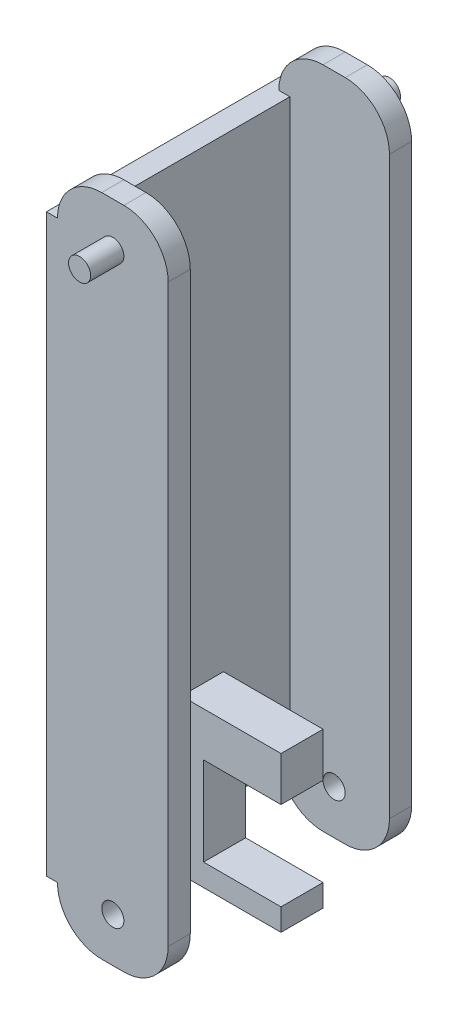
ISO-10303-21;
HEADER;
FILE_DESCRIPTION(('STEP AP214'),'2;1');
FILE_NAME('part.step','',(''),(''),'','','');
FILE_SCHEMA(('AUTOMOTIVE_DESIGN { 1 0 10303 214 1 1 1 1 }'));
ENDSEC;
DATA;
#1=APPLICATION_CONTEXT('core data for automotive mechanical design processes');
#2=APPLICATION_PROTOCOL_DEFINITION('international standard','automotive_design',2000,#1);
#3=PRODUCT_CONTEXT('',#1,'mechanical');
#4=PRODUCT('Part','Part','',(#3));
#5=PRODUCT_RELATED_PRODUCT_CATEGORY('part','',(#4));
#6=PRODUCT_DEFINITION_FORMATION('','',#4);
#7=PRODUCT_DEFINITION_CONTEXT('part definition',#1,'design');
#8=PRODUCT_DEFINITION('design','',#6,#7);
#9=PRODUCT_DEFINITION_SHAPE('','',#8);
#10=(LENGTH_UNIT() NAMED_UNIT(*) SI_UNIT(.MILLI.,.METRE.));
#11=(NAMED_UNIT(*) PLANE_ANGLE_UNIT() SI_UNIT($,.RADIAN.));
#12=(NAMED_UNIT(*) SI_UNIT($,.STERADIAN.) SOLID_ANGLE_UNIT());
#13=UNCERTAINTY_MEASURE_WITH_UNIT(LENGTH_MEASURE(1.E-05),#10,'distance_accuracy_value','');
#14=(GEOMETRIC_REPRESENTATION_CONTEXT(3) GLOBAL_UNCERTAINTY_ASSIGNED_CONTEXT((#13)) GLOBAL_UNIT_ASSIGNED_CONTEXT((#10,
#11,#12)) REPRESENTATION_CONTEXT('',''));
#15=CARTESIAN_POINT('',(0.,0.,0.));
#16=DIRECTION('',(0.,0.,1.));
#17=DIRECTION('',(1.,0.,0.));
#18=AXIS2_PLACEMENT_3D('',#15,#16,#17);
#19=CARTESIAN_POINT('',(-20.,0.,-45.));
#20=DIRECTION('',(-1.,0.,0.));
#21=DIRECTION('',(0.,0.,1.));
#22=AXIS2_PLACEMENT_3D('',#19,#20,#21);
#23=PLANE('',#22);
#24=DIRECTION('',(0.,0.,1.));
#25=VECTOR('',#24,1.);
#26=CARTESIAN_POINT('',(-20.,0.,-45.));
#27=LINE('',#26,#25);
#28=CARTESIAN_POINT('',(-20.,0.,-41.));
#29=VERTEX_POINT('',#28);
#30=CARTESIAN_POINT('',(-20.,0.,0.));
#31=VERTEX_POINT('',#30);
#32=EDGE_CURVE('E408',#29,#31,#27,.T.);
#33=ORIENTED_EDGE('',*,*,#32,.F.);
#34=DIRECTION('',(0.,-1.,0.));
#35=VECTOR('',#34,1.);
#36=CARTESIAN_POINT('',(-20.,30.,-41.));
#37=LINE('',#36,#35);
#38=CARTESIAN_POINT('',(-20.,50.,-41.));
#39=VERTEX_POINT('',#38);
#40=EDGE_CURVE('E275',#39,#29,#37,.T.);
#41=ORIENTED_EDGE('',*,*,#40,.F.);
#42=DIRECTION('',(0.,0.,1.));
#43=VECTOR('',#42,1.);
#44=CARTESIAN_POINT('',(-20.,50.,-41.));
#45=LINE('',#44,#43);
#46=CARTESIAN_POINT('',(-20.,50.,-60.));
#47=VERTEX_POINT('',#46);
#48=EDGE_CURVE('E55',#47,#39,#45,.T.);
#49=ORIENTED_EDGE('',*,*,#48,.F.);
#50=DIRECTION('',(0.,1.,0.));
#51=VECTOR('',#50,1.);
#52=CARTESIAN_POINT('',(-20.,50.,-60.));
#53=LINE('',#52,#51);
#54=CARTESIAN_POINT('',(-20.,0.,-60.));
#55=VERTEX_POINT('',#54);
#56=EDGE_CURVE('E270',#55,#47,#53,.T.);
#57=ORIENTED_EDGE('',*,*,#56,.F.);
#58=CARTESIAN_POINT('',(-20.,0.,-90.));
#59=VERTEX_POINT('',#58);
#60=EDGE_CURVE('E409',#59,#55,#27,.T.);
#61=ORIENTED_EDGE('',*,*,#60,.F.);
#62=DIRECTION('',(0.,-1.,0.));
#63=VECTOR('',#62,1.);
#64=CARTESIAN_POINT('',(-20.,0.,-90.));
#65=LINE('',#64,#63);
#66=CARTESIAN_POINT('',(-20.,260.,-90.));
#67=VERTEX_POINT('',#66);
#68=EDGE_CURVE('E324',#67,#59,#65,.T.);
#69=ORIENTED_EDGE('',*,*,#68,.F.);
#70=DIRECTION('',(0.,0.,1.));
#71=VECTOR('',#70,1.);
#72=CARTESIAN_POINT('',(-20.,260.,-45.));
#73=LINE('',#72,#71);
#74=CARTESIAN_POINT('',(-20.,260.,0.));
#75=VERTEX_POINT('',#74);
#76=EDGE_CURVE('E412',#67,#75,#73,.T.);
#77=ORIENTED_EDGE('',*,*,#76,.T.);
#78=DIRECTION('',(0.,-1.,0.));
#79=VECTOR('',#78,1.);
#80=CARTESIAN_POINT('',(-20.,0.,0.));
#81=LINE('',#80,#79);
#82=EDGE_CURVE('E402',#75,#31,#81,.T.);
#83=ORIENTED_EDGE('',*,*,#82,.T.);
#84=EDGE_LOOP('',(#33,#41,#49,#57,#61,#69,#77,#83));
#85=FACE_BOUND('',#84,.T.);
#86=ADVANCED_FACE('F32',(#85),#23,.F.);
#87=CARTESIAN_POINT('',(-25.,0.,-45.));
#88=DIRECTION('',(0.,1.,0.));
#89=DIRECTION('',(-1.,0.,0.));
#90=AXIS2_PLACEMENT_3D('',#87,#88,#89);
#91=PLANE('',#90);
#92=DIRECTION('',(1.,0.,0.));
#93=VECTOR('',#92,1.);
#94=CARTESIAN_POINT('',(-20.,0.,-60.));
#95=LINE('',#94,#93);
#96=CARTESIAN_POINT('',(-30.,0.,-60.));
#97=VERTEX_POINT('',#96);
#98=EDGE_CURVE('E312',#97,#55,#95,.T.);
#99=ORIENTED_EDGE('',*,*,#98,.F.);
#100=DIRECTION('',(0.,0.,1.));
#101=VECTOR('',#100,1.);
#102=CARTESIAN_POINT('',(-30.,0.,-60.));
#103=LINE('',#102,#101);
#104=CARTESIAN_POINT('',(-30.,0.,-100.));
#105=VERTEX_POINT('',#104);
#106=EDGE_CURVE('E513',#105,#97,#103,.T.);
#107=ORIENTED_EDGE('',*,*,#106,.F.);
#108=DIRECTION('',(1.,0.,0.));
#109=VECTOR('',#108,1.);
#110=CARTESIAN_POINT('',(-30.,0.,-100.));
#111=LINE('',#110,#109);
#112=CARTESIAN_POINT('',(-25.,0.,-100.));
#113=VERTEX_POINT('',#112);
#114=EDGE_CURVE('E262',#105,#113,#111,.T.);
#115=ORIENTED_EDGE('',*,*,#114,.T.);
#116=DIRECTION('',(0.,0.,1.));
#117=VECTOR('',#116,1.);
#118=CARTESIAN_POINT('',(-25.,0.,-100.));
#119=LINE('',#118,#117);
#120=CARTESIAN_POINT('',(-25.,0.,-90.));
#121=VERTEX_POINT('',#120);
#122=EDGE_CURVE('E388',#113,#121,#119,.T.);
#123=ORIENTED_EDGE('',*,*,#122,.T.);
#124=DIRECTION('',(-1.,0.,0.));
#125=VECTOR('',#124,1.);
#126=CARTESIAN_POINT('',(-25.,0.,-90.));
#127=LINE('',#126,#125);
#128=EDGE_CURVE('E327',#59,#121,#127,.T.);
#129=ORIENTED_EDGE('',*,*,#128,.F.);
#130=ORIENTED_EDGE('',*,*,#60,.T.);
#131=EDGE_LOOP('',(#99,#107,#115,#123,#129,#130));
#132=FACE_BOUND('',#131,.T.);
#133=ADVANCED_FACE('F529',(#132),#91,.F.);
#134=DIRECTION('',(-1.,0.,0.));
#135=VECTOR('',#134,1.);
#136=CARTESIAN_POINT('',(-25.,0.,-41.));
#137=LINE('',#136,#135);
#138=CARTESIAN_POINT('',(-30.,0.,-41.));
#139=VERTEX_POINT('',#138);
#140=EDGE_CURVE('E316',#29,#139,#137,.T.);
#141=ORIENTED_EDGE('',*,*,#140,.F.);
#142=ORIENTED_EDGE('',*,*,#32,.T.);
#143=DIRECTION('',(-1.,0.,0.));
#144=VECTOR('',#143,1.);
#145=CARTESIAN_POINT('',(-25.,0.,0.));
#146=LINE('',#145,#144);
#147=CARTESIAN_POINT('',(-25.,0.,0.));
#148=VERTEX_POINT('',#147);
#149=EDGE_CURVE('E405',#31,#148,#146,.T.);
#150=ORIENTED_EDGE('',*,*,#149,.T.);
#151=DIRECTION('',(0.,0.,-1.));
#152=VECTOR('',#151,1.);
#153=CARTESIAN_POINT('',(-25.,0.,10.));
#154=LINE('',#153,#152);
#155=CARTESIAN_POINT('',(-25.,0.,10.));
#156=VERTEX_POINT('',#155);
#157=EDGE_CURVE('E462',#156,#148,#154,.T.);
#158=ORIENTED_EDGE('',*,*,#157,.F.);
#159=DIRECTION('',(1.,0.,0.));
#160=VECTOR('',#159,1.);
#161=CARTESIAN_POINT('',(-30.,0.,10.));
#162=LINE('',#161,#160);
#163=CARTESIAN_POINT('',(-30.,0.,10.));
#164=VERTEX_POINT('',#163);
#165=EDGE_CURVE('E526',#164,#156,#162,.T.);
#166=ORIENTED_EDGE('',*,*,#165,.F.);
#167=DIRECTION('',(0.,0.,1.));
#168=VECTOR('',#167,1.);
#169=CARTESIAN_POINT('',(-30.,0.,10.));
#170=LINE('',#169,#168);
#171=EDGE_CURVE('E247',#139,#164,#170,.T.);
#172=ORIENTED_EDGE('',*,*,#171,.F.);
#173=EDGE_LOOP('',(#141,#142,#150,#158,#166,#172));
#174=FACE_BOUND('',#173,.T.);
#175=ADVANCED_FACE('F588',(#174),#91,.F.);
#176=CARTESIAN_POINT('',(5.,0.,0.));
#177=DIRECTION('',(0.,0.,1.));
#178=DIRECTION('',(1.,0.,0.));
#179=AXIS2_PLACEMENT_3D('',#176,#177,#178);
#180=PLANE('',#179);
#181=CARTESIAN_POINT('',(0.,0.,0.));
#182=DIRECTION('',(0.,0.,1.));
#183=DIRECTION('',(1.,0.,0.));
#184=AXIS2_PLACEMENT_3D('',#181,#182,#183);
#185=CIRCLE('',#184,5.);
#186=CARTESIAN_POINT('',(5.,0.,0.));
#187=VERTEX_POINT('',#186);
#188=EDGE_CURVE('E419',#187,#187,#185,.T.);
#189=ORIENTED_EDGE('',*,*,#188,.T.);
#190=EDGE_LOOP('',(#189));
#191=FACE_BOUND('',#190,.T.);
#192=ORIENTED_EDGE('',*,*,#149,.F.);
#193=ORIENTED_EDGE('',*,*,#82,.F.);
#194=DIRECTION('',(1.,0.,0.));
#195=VECTOR('',#194,1.);
#196=CARTESIAN_POINT('',(-20.,260.,0.));
#197=LINE('',#196,#195);
#198=CARTESIAN_POINT('',(-25.,260.,0.));
#199=VERTEX_POINT('',#198);
#200=EDGE_CURVE('E400',#199,#75,#197,.T.);
#201=ORIENTED_EDGE('',*,*,#200,.F.);
#202=CARTESIAN_POINT('',(-5.,260.,0.));
#203=DIRECTION('',(0.,0.,1.));
#204=DIRECTION('',(-1.,0.,0.));
#205=AXIS2_PLACEMENT_3D('',#202,#203,#204);
#206=CIRCLE('',#205,20.);
#207=CARTESIAN_POINT('',(-5.,280.,0.));
#208=VERTEX_POINT('',#207);
#209=EDGE_CURVE('E451',#208,#199,#206,.T.);
#210=ORIENTED_EDGE('',*,*,#209,.F.);
#211=DIRECTION('',(-1.,0.,0.));
#212=VECTOR('',#211,1.);
#213=CARTESIAN_POINT('',(-5.,280.,0.));
#214=LINE('',#213,#212);
#215=CARTESIAN_POINT('',(4.99999999999996,280.,0.));
#216=VERTEX_POINT('',#215);
#217=EDGE_CURVE('E449',#216,#208,#214,.T.);
#218=ORIENTED_EDGE('',*,*,#217,.F.);
#219=CARTESIAN_POINT('',(4.99999999999996,260.,0.));
#220=DIRECTION('',(0.,0.,1.));
#221=DIRECTION('',(-1.,0.,0.));
#222=AXIS2_PLACEMENT_3D('',#219,#220,#221);
#223=CIRCLE('',#222,20.);
#224=CARTESIAN_POINT('',(25.,260.,0.));
#225=VERTEX_POINT('',#224);
#226=EDGE_CURVE('E447',#225,#216,#223,.T.);
#227=ORIENTED_EDGE('',*,*,#226,.F.);
#228=DIRECTION('',(0.,1.,0.));
#229=VECTOR('',#228,1.);
#230=CARTESIAN_POINT('',(25.,260.,0.));
#231=LINE('',#230,#229);
#232=CARTESIAN_POINT('',(25.,0.,0.));
#233=VERTEX_POINT('',#232);
#234=EDGE_CURVE('E445',#233,#225,#231,.T.);
#235=ORIENTED_EDGE('',*,*,#234,.F.);
#236=CARTESIAN_POINT('',(5.,0.,0.));
#237=DIRECTION('',(0.,0.,1.));
#238=DIRECTION('',(1.,0.,0.));
#239=AXIS2_PLACEMENT_3D('',#236,#237,#238);
#240=CIRCLE('',#239,20.);
#241=CARTESIAN_POINT('',(5.,-20.,0.));
#242=VERTEX_POINT('',#241);
#243=EDGE_CURVE('E425',#242,#233,#240,.T.);
#244=ORIENTED_EDGE('',*,*,#243,.F.);
#245=DIRECTION('',(1.,0.,0.));
#246=VECTOR('',#245,1.);
#247=CARTESIAN_POINT('',(-5.,-20.,0.));
#248=LINE('',#247,#246);
#249=CARTESIAN_POINT('',(-5.,-20.,0.));
#250=VERTEX_POINT('',#249);
#251=EDGE_CURVE('E431',#250,#242,#248,.T.);
#252=ORIENTED_EDGE('',*,*,#251,.F.);
#253=CARTESIAN_POINT('',(-5.,0.,0.));
#254=DIRECTION('',(0.,0.,1.));
#255=DIRECTION('',(-1.,0.,0.));
#256=AXIS2_PLACEMENT_3D('',#253,#254,#255);
#257=CIRCLE('',#256,20.);
#258=EDGE_CURVE('E454',#148,#250,#257,.T.);
#259=ORIENTED_EDGE('',*,*,#258,.F.);
#260=EDGE_LOOP('',(#192,#193,#201,#210,#218,#227,#235,#244,#252,#259));
#261=FACE_BOUND('',#260,.T.);
#262=ADVANCED_FACE('F482',(#191,#261),#180,.F.);
#263=CARTESIAN_POINT('',(5.,0.,10.));
#264=DIRECTION('',(0.,0.,1.));
#265=DIRECTION('',(1.,0.,0.));
#266=AXIS2_PLACEMENT_3D('',#263,#264,#265);
#267=PLANE('',#266);
#268=CARTESIAN_POINT('',(0.,260.,10.));
#269=DIRECTION('',(0.,0.,1.));
#270=DIRECTION('',(1.,0.,0.));
#271=AXIS2_PLACEMENT_3D('',#268,#269,#270);
#272=CIRCLE('',#271,5.);
#273=CARTESIAN_POINT('',(5.00000000000001,260.,10.));
#274=VERTEX_POINT('',#273);
#275=EDGE_CURVE('E415',#274,#274,#272,.T.);
#276=ORIENTED_EDGE('',*,*,#275,.F.);
#277=EDGE_LOOP('',(#276));
#278=FACE_BOUND('',#277,.T.);
#279=CARTESIAN_POINT('',(5.,0.,10.));
#280=DIRECTION('',(0.,0.,1.));
#281=DIRECTION('',(1.,0.,0.));
#282=AXIS2_PLACEMENT_3D('',#279,#280,#281);
#283=CIRCLE('',#282,20.);
#284=CARTESIAN_POINT('',(5.,-20.,10.));
#285=VERTEX_POINT('',#284);
#286=CARTESIAN_POINT('',(25.,0.,10.));
#287=VERTEX_POINT('',#286);
#288=EDGE_CURVE('E428',#285,#287,#283,.T.);
#289=ORIENTED_EDGE('',*,*,#288,.T.);
#290=DIRECTION('',(0.,1.,0.));
#291=VECTOR('',#290,1.);
#292=CARTESIAN_POINT('',(25.,260.,10.));
#293=LINE('',#292,#291);
#294=CARTESIAN_POINT('',(25.,260.,10.));
#295=VERTEX_POINT('',#294);
#296=EDGE_CURVE('E430',#287,#295,#293,.T.);
#297=ORIENTED_EDGE('',*,*,#296,.T.);
#298=CARTESIAN_POINT('',(4.99999999999996,260.,10.));
#299=DIRECTION('',(0.,0.,1.));
#300=DIRECTION('',(-1.,0.,0.));
#301=AXIS2_PLACEMENT_3D('',#298,#299,#300);
#302=CIRCLE('',#301,20.);
#303=CARTESIAN_POINT('',(4.99999999999996,280.,10.));
#304=VERTEX_POINT('',#303);
#305=EDGE_CURVE('E433',#295,#304,#302,.T.);
#306=ORIENTED_EDGE('',*,*,#305,.T.);
#307=DIRECTION('',(-1.,0.,0.));
#308=VECTOR('',#307,1.);
#309=CARTESIAN_POINT('',(-5.,280.,10.));
#310=LINE('',#309,#308);
#311=CARTESIAN_POINT('',(-5.,280.,10.));
#312=VERTEX_POINT('',#311);
#313=EDGE_CURVE('E435',#304,#312,#310,.T.);
#314=ORIENTED_EDGE('',*,*,#313,.T.);
#315=CARTESIAN_POINT('',(-5.,260.,10.));
#316=DIRECTION('',(0.,0.,1.));
#317=DIRECTION('',(-1.,0.,0.));
#318=AXIS2_PLACEMENT_3D('',#315,#316,#317);
#319=CIRCLE('',#318,20.);
#320=CARTESIAN_POINT('',(-25.,260.,10.));
#321=VERTEX_POINT('',#320);
#322=EDGE_CURVE('E256',#312,#321,#319,.T.);
#323=ORIENTED_EDGE('',*,*,#322,.T.);
#324=DIRECTION('',(1.,0.,0.));
#325=VECTOR('',#324,1.);
#326=CARTESIAN_POINT('',(-30.,260.,10.));
#327=LINE('',#326,#325);
#328=CARTESIAN_POINT('',(-30.,260.,10.));
#329=VERTEX_POINT('',#328);
#330=EDGE_CURVE('E234',#329,#321,#327,.T.);
#331=ORIENTED_EDGE('',*,*,#330,.F.);
#332=DIRECTION('',(0.,1.,0.));
#333=VECTOR('',#332,1.);
#334=CARTESIAN_POINT('',(-30.,260.,10.));
#335=LINE('',#334,#333);
#336=EDGE_CURVE('E241',#164,#329,#335,.T.);
#337=ORIENTED_EDGE('',*,*,#336,.F.);
#338=ORIENTED_EDGE('',*,*,#165,.T.);
#339=CARTESIAN_POINT('',(-5.,0.,10.));
#340=DIRECTION('',(0.,0.,1.));
#341=DIRECTION('',(-1.,0.,0.));
#342=AXIS2_PLACEMENT_3D('',#339,#340,#341);
#343=CIRCLE('',#342,20.);
#344=CARTESIAN_POINT('',(-5.,-20.,10.));
#345=VERTEX_POINT('',#344);
#346=EDGE_CURVE('E438',#156,#345,#343,.T.);
#347=ORIENTED_EDGE('',*,*,#346,.T.);
#348=DIRECTION('',(1.,0.,0.));
#349=VECTOR('',#348,1.);
#350=CARTESIAN_POINT('',(-5.,-20.,10.));
#351=LINE('',#350,#349);
#352=EDGE_CURVE('E440',#345,#285,#351,.T.);
#353=ORIENTED_EDGE('',*,*,#352,.T.);
#354=EDGE_LOOP('',(#289,#297,#306,#314,#323,#331,#337,#338,#347,#353));
#355=FACE_BOUND('',#354,.T.);
#356=CARTESIAN_POINT('',(0.,0.,10.));
#357=DIRECTION('',(0.,0.,1.));
#358=DIRECTION('',(1.,0.,0.));
#359=AXIS2_PLACEMENT_3D('',#356,#357,#358);
#360=CIRCLE('',#359,5.);
#361=CARTESIAN_POINT('',(5.,0.,10.));
#362=VERTEX_POINT('',#361);
#363=EDGE_CURVE('E422',#362,#362,#360,.T.);
#364=ORIENTED_EDGE('',*,*,#363,.F.);
#365=EDGE_LOOP('',(#364));
#366=FACE_BOUND('',#365,.T.);
#367=ADVANCED_FACE('F253',(#278,#355,#366),#267,.T.);
#368=CARTESIAN_POINT('',(5.,0.,10.));
#369=DIRECTION('',(0.,0.,-1.));
#370=DIRECTION('',(-1.,0.,0.));
#371=AXIS2_PLACEMENT_3D('',#368,#369,#370);
#372=CYLINDRICAL_SURFACE('',#371,20.);
#373=ORIENTED_EDGE('',*,*,#243,.T.);
#374=DIRECTION('',(0.,0.,-1.));
#375=VECTOR('',#374,1.);
#376=CARTESIAN_POINT('',(25.,0.,10.));
#377=LINE('',#376,#375);
#378=EDGE_CURVE('E11',#287,#233,#377,.T.);
#379=ORIENTED_EDGE('',*,*,#378,.F.);
#380=ORIENTED_EDGE('',*,*,#288,.F.);
#381=DIRECTION('',(0.,0.,-1.));
#382=VECTOR('',#381,1.);
#383=CARTESIAN_POINT('',(5.,-20.,10.));
#384=LINE('',#383,#382);
#385=EDGE_CURVE('E442',#285,#242,#384,.T.);
#386=ORIENTED_EDGE('',*,*,#385,.T.);
#387=EDGE_LOOP('',(#373,#379,#380,#386));
#388=FACE_BOUND('',#387,.T.);
#389=ADVANCED_FACE('F34',(#388),#372,.T.);
#390=CARTESIAN_POINT('',(25.,260.,10.));
#391=DIRECTION('',(-1.,0.,0.));
#392=DIRECTION('',(0.,-1.,0.));
#393=AXIS2_PLACEMENT_3D('',#390,#391,#392);
#394=PLANE('',#393);
#395=ORIENTED_EDGE('',*,*,#234,.T.);
#396=DIRECTION('',(0.,0.,-1.));
#397=VECTOR('',#396,1.);
#398=CARTESIAN_POINT('',(25.,260.,10.));
#399=LINE('',#398,#397);
#400=EDGE_CURVE('E40',#295,#225,#399,.T.);
#401=ORIENTED_EDGE('',*,*,#400,.F.);
#402=ORIENTED_EDGE('',*,*,#296,.F.);
#403=ORIENTED_EDGE('',*,*,#378,.T.);
#404=EDGE_LOOP('',(#395,#401,#402,#403));
#405=FACE_BOUND('',#404,.T.);
#406=ADVANCED_FACE('F625',(#405),#394,.F.);
#407=CARTESIAN_POINT('',(4.99999999999996,260.,10.));
#408=DIRECTION('',(0.,0.,-1.));
#409=DIRECTION('',(-1.,0.,0.));
#410=AXIS2_PLACEMENT_3D('',#407,#408,#409);
#411=CYLINDRICAL_SURFACE('',#410,20.);
#412=ORIENTED_EDGE('',*,*,#226,.T.);
#413=DIRECTION('',(0.,0.,-1.));
#414=VECTOR('',#413,1.);
#415=CARTESIAN_POINT('',(4.99999999999996,280.,10.));
#416=LINE('',#415,#414);
#417=EDGE_CURVE('E469',#304,#216,#416,.T.);
#418=ORIENTED_EDGE('',*,*,#417,.F.);
#419=ORIENTED_EDGE('',*,*,#305,.F.);
#420=ORIENTED_EDGE('',*,*,#400,.T.);
#421=EDGE_LOOP('',(#412,#418,#419,#420));
#422=FACE_BOUND('',#421,.T.);
#423=ADVANCED_FACE('F476',(#422),#411,.T.);
#424=CARTESIAN_POINT('',(-5.,280.,10.));
#425=DIRECTION('',(0.,-1.,0.));
#426=DIRECTION('',(0.,0.,-1.));
#427=AXIS2_PLACEMENT_3D('',#424,#425,#426);
#428=PLANE('',#427);
#429=ORIENTED_EDGE('',*,*,#217,.T.);
#430=DIRECTION('',(0.,0.,-1.));
#431=VECTOR('',#430,1.);
#432=CARTESIAN_POINT('',(-5.,280.,10.));
#433=LINE('',#432,#431);
#434=EDGE_CURVE('E466',#312,#208,#433,.T.);
#435=ORIENTED_EDGE('',*,*,#434,.F.);
#436=ORIENTED_EDGE('',*,*,#313,.F.);
#437=ORIENTED_EDGE('',*,*,#417,.T.);
#438=EDGE_LOOP('',(#429,#435,#436,#437));
#439=FACE_BOUND('',#438,.T.);
#440=ADVANCED_FACE('F488',(#439),#428,.F.);
#441=CARTESIAN_POINT('',(-5.,260.,10.));
#442=DIRECTION('',(0.,0.,-1.));
#443=DIRECTION('',(-1.,0.,0.));
#444=AXIS2_PLACEMENT_3D('',#441,#442,#443);
#445=CYLINDRICAL_SURFACE('',#444,20.);
#446=ORIENTED_EDGE('',*,*,#209,.T.);
#447=DIRECTION('',(0.,0.,-1.));
#448=VECTOR('',#447,1.);
#449=CARTESIAN_POINT('',(-25.,260.,10.));
#450=LINE('',#449,#448);
#451=EDGE_CURVE('E464',#321,#199,#450,.T.);
#452=ORIENTED_EDGE('',*,*,#451,.F.);
#453=ORIENTED_EDGE('',*,*,#322,.F.);
#454=ORIENTED_EDGE('',*,*,#434,.T.);
#455=EDGE_LOOP('',(#446,#452,#453,#454));
#456=FACE_BOUND('',#455,.T.);
#457=ADVANCED_FACE('F491',(#456),#445,.T.);
#458=CARTESIAN_POINT('',(-5.,0.,10.));
#459=DIRECTION('',(0.,0.,-1.));
#460=DIRECTION('',(-1.,0.,0.));
#461=AXIS2_PLACEMENT_3D('',#458,#459,#460);
#462=CYLINDRICAL_SURFACE('',#461,20.);
#463=ORIENTED_EDGE('',*,*,#258,.T.);
#464=DIRECTION('',(0.,0.,-1.));
#465=VECTOR('',#464,1.);
#466=CARTESIAN_POINT('',(-5.,-20.,10.));
#467=LINE('',#466,#465);
#468=EDGE_CURVE('E459',#345,#250,#467,.T.);
#469=ORIENTED_EDGE('',*,*,#468,.F.);
#470=ORIENTED_EDGE('',*,*,#346,.F.);
#471=ORIENTED_EDGE('',*,*,#157,.T.);
#472=EDGE_LOOP('',(#463,#469,#470,#471));
#473=FACE_BOUND('',#472,.T.);
#474=ADVANCED_FACE('F615',(#473),#462,.T.);
#475=CARTESIAN_POINT('',(-5.,-20.,10.));
#476=DIRECTION('',(0.,1.,0.));
#477=DIRECTION('',(-1.,0.,0.));
#478=AXIS2_PLACEMENT_3D('',#475,#476,#477);
#479=PLANE('',#478);
#480=ORIENTED_EDGE('',*,*,#251,.T.);
#481=ORIENTED_EDGE('',*,*,#385,.F.);
#482=ORIENTED_EDGE('',*,*,#352,.F.);
#483=ORIENTED_EDGE('',*,*,#468,.T.);
#484=EDGE_LOOP('',(#480,#481,#482,#483));
#485=FACE_BOUND('',#484,.T.);
#486=ADVANCED_FACE('F605',(#485),#479,.F.);
#487=CARTESIAN_POINT('',(0.,0.,10.));
#488=DIRECTION('',(0.,0.,-1.));
#489=DIRECTION('',(-1.,0.,0.));
#490=AXIS2_PLACEMENT_3D('',#487,#488,#489);
#491=CYLINDRICAL_SURFACE('',#490,5.);
#492=ORIENTED_EDGE('',*,*,#363,.T.);
#493=EDGE_LOOP('',(#492));
#494=FACE_BOUND('',#493,.T.);
#495=ORIENTED_EDGE('',*,*,#188,.F.);
#496=EDGE_LOOP('',(#495));
#497=FACE_BOUND('',#496,.T.);
#498=ADVANCED_FACE('F601',(#494,#497),#491,.F.);
#499=CARTESIAN_POINT('',(0.,260.,25.));
#500=DIRECTION('',(0.,0.,-1.));
#501=DIRECTION('',(-1.,0.,0.));
#502=AXIS2_PLACEMENT_3D('',#499,#500,#501);
#503=CYLINDRICAL_SURFACE('',#502,5.);
#504=CARTESIAN_POINT('',(0.,260.,25.));
#505=DIRECTION('',(0.,0.,1.));
#506=DIRECTION('',(1.,0.,0.));
#507=AXIS2_PLACEMENT_3D('',#504,#505,#506);
#508=CIRCLE('',#507,5.);
#509=CARTESIAN_POINT('',(5.00000000000001,260.,25.));
#510=VERTEX_POINT('',#509);
#511=EDGE_CURVE('E416',#510,#510,#508,.T.);
#512=ORIENTED_EDGE('',*,*,#511,.F.);
#513=EDGE_LOOP('',(#512));
#514=FACE_BOUND('',#513,.T.);
#515=ORIENTED_EDGE('',*,*,#275,.T.);
#516=EDGE_LOOP('',(#515));
#517=FACE_BOUND('',#516,.T.);
#518=ADVANCED_FACE('F597',(#514,#517),#503,.T.);
#519=CARTESIAN_POINT('',(0.,260.,25.));
#520=DIRECTION('',(0.,0.,1.));
#521=DIRECTION('',(1.,0.,0.));
#522=AXIS2_PLACEMENT_3D('',#519,#520,#521);
#523=PLANE('',#522);
#524=ORIENTED_EDGE('',*,*,#511,.T.);
#525=EDGE_LOOP('',(#524));
#526=FACE_BOUND('',#525,.T.);
#527=ADVANCED_FACE('F594',(#526),#523,.T.);
#528=CARTESIAN_POINT('',(-20.,260.,-45.));
#529=DIRECTION('',(0.,-1.,0.));
#530=DIRECTION('',(1.,0.,0.));
#531=AXIS2_PLACEMENT_3D('',#528,#529,#530);
#532=PLANE('',#531);
#533=ORIENTED_EDGE('',*,*,#200,.T.);
#534=ORIENTED_EDGE('',*,*,#76,.F.);
#535=DIRECTION('',(1.,0.,0.));
#536=VECTOR('',#535,1.);
#537=CARTESIAN_POINT('',(-20.,260.,-90.));
#538=LINE('',#537,#536);
#539=CARTESIAN_POINT('',(-25.,260.,-90.));
#540=VERTEX_POINT('',#539);
#541=EDGE_CURVE('E318',#540,#67,#538,.T.);
#542=ORIENTED_EDGE('',*,*,#541,.F.);
#543=DIRECTION('',(0.,0.,1.));
#544=VECTOR('',#543,1.);
#545=CARTESIAN_POINT('',(-25.,260.,-100.));
#546=LINE('',#545,#544);
#547=CARTESIAN_POINT('',(-25.,260.,-100.));
#548=VERTEX_POINT('',#547);
#549=EDGE_CURVE('E390',#548,#540,#546,.T.);
#550=ORIENTED_EDGE('',*,*,#549,.F.);
#551=DIRECTION('',(1.,0.,0.));
#552=VECTOR('',#551,1.);
#553=CARTESIAN_POINT('',(-30.,260.,-100.));
#554=LINE('',#553,#552);
#555=CARTESIAN_POINT('',(-30.,260.,-100.));
#556=VERTEX_POINT('',#555);
#557=EDGE_CURVE('E237',#556,#548,#554,.T.);
#558=ORIENTED_EDGE('',*,*,#557,.F.);
#559=DIRECTION('',(0.,0.,-1.));
#560=VECTOR('',#559,1.);
#561=CARTESIAN_POINT('',(-30.,260.,-100.));
#562=LINE('',#561,#560);
#563=EDGE_CURVE('E229',#329,#556,#562,.T.);
#564=ORIENTED_EDGE('',*,*,#563,.F.);
#565=ORIENTED_EDGE('',*,*,#330,.T.);
#566=ORIENTED_EDGE('',*,*,#451,.T.);
#567=EDGE_LOOP('',(#533,#534,#542,#550,#558,#564,#565,#566));
#568=FACE_BOUND('',#567,.T.);
#569=ADVANCED_FACE('F232',(#568),#532,.F.);
#570=CARTESIAN_POINT('',(5.,0.,-90.));
#571=DIRECTION('',(0.,0.,-1.));
#572=DIRECTION('',(1.,0.,0.));
#573=AXIS2_PLACEMENT_3D('',#570,#571,#572);
#574=PLANE('',#573);
#575=CARTESIAN_POINT('',(0.,0.,-90.));
#576=DIRECTION('',(0.,0.,1.));
#577=DIRECTION('',(1.,0.,0.));
#578=AXIS2_PLACEMENT_3D('',#575,#576,#577);
#579=CIRCLE('',#578,5.);
#580=CARTESIAN_POINT('',(5.,0.,-90.));
#581=VERTEX_POINT('',#580);
#582=EDGE_CURVE('E334',#581,#581,#579,.T.);
#583=ORIENTED_EDGE('',*,*,#582,.F.);
#584=EDGE_LOOP('',(#583));
#585=FACE_BOUND('',#584,.T.);
#586=ORIENTED_EDGE('',*,*,#128,.T.);
#587=CARTESIAN_POINT('',(-5.,0.,-90.));
#588=DIRECTION('',(0.,0.,1.));
#589=DIRECTION('',(-1.,0.,0.));
#590=AXIS2_PLACEMENT_3D('',#587,#588,#589);
#591=CIRCLE('',#590,20.);
#592=CARTESIAN_POINT('',(-5.,-20.,-90.));
#593=VERTEX_POINT('',#592);
#594=EDGE_CURVE('E380',#121,#593,#591,.T.);
#595=ORIENTED_EDGE('',*,*,#594,.T.);
#596=DIRECTION('',(1.,0.,0.));
#597=VECTOR('',#596,1.);
#598=CARTESIAN_POINT('',(-5.,-20.,-90.));
#599=LINE('',#598,#597);
#600=CARTESIAN_POINT('',(5.,-20.,-90.));
#601=VERTEX_POINT('',#600);
#602=EDGE_CURVE('E347',#593,#601,#599,.T.);
#603=ORIENTED_EDGE('',*,*,#602,.T.);
#604=CARTESIAN_POINT('',(5.,0.,-90.));
#605=DIRECTION('',(0.,0.,1.));
#606=DIRECTION('',(1.,0.,0.));
#607=AXIS2_PLACEMENT_3D('',#604,#605,#606);
#608=CIRCLE('',#607,20.);
#609=CARTESIAN_POINT('',(25.,0.,-90.));
#610=VERTEX_POINT('',#609);
#611=EDGE_CURVE('E340',#601,#610,#608,.T.);
#612=ORIENTED_EDGE('',*,*,#611,.T.);
#613=DIRECTION('',(0.,1.,0.));
#614=VECTOR('',#613,1.);
#615=CARTESIAN_POINT('',(25.,260.,-90.));
#616=LINE('',#615,#614);
#617=CARTESIAN_POINT('',(25.,260.,-90.));
#618=VERTEX_POINT('',#617);
#619=EDGE_CURVE('E368',#610,#618,#616,.T.);
#620=ORIENTED_EDGE('',*,*,#619,.T.);
#621=CARTESIAN_POINT('',(4.99999999999996,260.,-90.));
#622=DIRECTION('',(0.,0.,1.));
#623=DIRECTION('',(-1.,0.,0.));
#624=AXIS2_PLACEMENT_3D('',#621,#622,#623);
#625=CIRCLE('',#624,20.);
#626=CARTESIAN_POINT('',(4.99999999999996,280.,-90.));
#627=VERTEX_POINT('',#626);
#628=EDGE_CURVE('E371',#618,#627,#625,.T.);
#629=ORIENTED_EDGE('',*,*,#628,.T.);
#630=DIRECTION('',(-1.,0.,0.));
#631=VECTOR('',#630,1.);
#632=CARTESIAN_POINT('',(-5.,280.,-90.));
#633=LINE('',#632,#631);
#634=CARTESIAN_POINT('',(-5.,280.,-90.));
#635=VERTEX_POINT('',#634);
#636=EDGE_CURVE('E374',#627,#635,#633,.T.);
#637=ORIENTED_EDGE('',*,*,#636,.T.);
#638=CARTESIAN_POINT('',(-5.,260.,-90.));
#639=DIRECTION('',(0.,0.,1.));
#640=DIRECTION('',(-1.,0.,0.));
#641=AXIS2_PLACEMENT_3D('',#638,#639,#640);
#642=CIRCLE('',#641,20.);
#643=EDGE_CURVE('E377',#635,#540,#642,.T.);
#644=ORIENTED_EDGE('',*,*,#643,.T.);
#645=ORIENTED_EDGE('',*,*,#541,.T.);
#646=ORIENTED_EDGE('',*,*,#68,.T.);
#647=EDGE_LOOP('',(#586,#595,#603,#612,#620,#629,#637,#644,#645,#646));
#648=FACE_BOUND('',#647,.T.);
#649=ADVANCED_FACE('F498',(#585,#648),#574,.F.);
#650=CARTESIAN_POINT('',(5.,0.,-100.));
#651=DIRECTION('',(0.,0.,-1.));
#652=DIRECTION('',(1.,0.,0.));
#653=AXIS2_PLACEMENT_3D('',#650,#651,#652);
#654=PLANE('',#653);
#655=CARTESIAN_POINT('',(0.,260.,-100.));
#656=DIRECTION('',(0.,0.,1.));
#657=DIRECTION('',(1.,0.,0.));
#658=AXIS2_PLACEMENT_3D('',#655,#656,#657);
#659=CIRCLE('',#658,5.);
#660=CARTESIAN_POINT('',(5.00000000000001,260.,-100.));
#661=VERTEX_POINT('',#660);
#662=EDGE_CURVE('E330',#661,#661,#659,.T.);
#663=ORIENTED_EDGE('',*,*,#662,.T.);
#664=EDGE_LOOP('',(#663));
#665=FACE_BOUND('',#664,.T.);
#666=CARTESIAN_POINT('',(5.,0.,-100.));
#667=DIRECTION('',(0.,0.,1.));
#668=DIRECTION('',(1.,0.,0.));
#669=AXIS2_PLACEMENT_3D('',#666,#667,#668);
#670=CIRCLE('',#669,20.);
#671=CARTESIAN_POINT('',(5.,-20.,-100.));
#672=VERTEX_POINT('',#671);
#673=CARTESIAN_POINT('',(25.,0.,-100.));
#674=VERTEX_POINT('',#673);
#675=EDGE_CURVE('E343',#672,#674,#670,.T.);
#676=ORIENTED_EDGE('',*,*,#675,.F.);
#677=DIRECTION('',(1.,0.,0.));
#678=VECTOR('',#677,1.);
#679=CARTESIAN_POINT('',(-5.,-20.,-100.));
#680=LINE('',#679,#678);
#681=CARTESIAN_POINT('',(-5.,-20.,-100.));
#682=VERTEX_POINT('',#681);
#683=EDGE_CURVE('E362',#682,#672,#680,.T.);
#684=ORIENTED_EDGE('',*,*,#683,.F.);
#685=CARTESIAN_POINT('',(-5.,0.,-100.));
#686=DIRECTION('',(0.,0.,1.));
#687=DIRECTION('',(-1.,0.,0.));
#688=AXIS2_PLACEMENT_3D('',#685,#686,#687);
#689=CIRCLE('',#688,20.);
#690=EDGE_CURVE('E359',#113,#682,#689,.T.);
#691=ORIENTED_EDGE('',*,*,#690,.F.);
#692=ORIENTED_EDGE('',*,*,#114,.F.);
#693=DIRECTION('',(0.,-1.,0.));
#694=VECTOR('',#693,1.);
#695=CARTESIAN_POINT('',(-30.,0.,-100.));
#696=LINE('',#695,#694);
#697=EDGE_CURVE('E240',#556,#105,#696,.T.);
#698=ORIENTED_EDGE('',*,*,#697,.F.);
#699=ORIENTED_EDGE('',*,*,#557,.T.);
#700=CARTESIAN_POINT('',(-5.,260.,-100.));
#701=DIRECTION('',(0.,0.,1.));
#702=DIRECTION('',(-1.,0.,0.));
#703=AXIS2_PLACEMENT_3D('',#700,#701,#702);
#704=CIRCLE('',#703,20.);
#705=CARTESIAN_POINT('',(-5.,280.,-100.));
#706=VERTEX_POINT('',#705);
#707=EDGE_CURVE('E356',#706,#548,#704,.T.);
#708=ORIENTED_EDGE('',*,*,#707,.F.);
#709=DIRECTION('',(-1.,0.,0.));
#710=VECTOR('',#709,1.);
#711=CARTESIAN_POINT('',(-5.,280.,-100.));
#712=LINE('',#711,#710);
#713=CARTESIAN_POINT('',(4.99999999999996,280.,-100.));
#714=VERTEX_POINT('',#713);
#715=EDGE_CURVE('E353',#714,#706,#712,.T.);
#716=ORIENTED_EDGE('',*,*,#715,.F.);
#717=CARTESIAN_POINT('',(4.99999999999996,260.,-100.));
#718=DIRECTION('',(0.,0.,1.));
#719=DIRECTION('',(-1.,0.,0.));
#720=AXIS2_PLACEMENT_3D('',#717,#718,#719);
#721=CIRCLE('',#720,20.);
#722=CARTESIAN_POINT('',(25.,260.,-100.));
#723=VERTEX_POINT('',#722);
#724=EDGE_CURVE('E350',#723,#714,#721,.T.);
#725=ORIENTED_EDGE('',*,*,#724,.F.);
#726=DIRECTION('',(0.,1.,0.));
#727=VECTOR('',#726,1.);
#728=CARTESIAN_POINT('',(25.,260.,-100.));
#729=LINE('',#728,#727);
#730=EDGE_CURVE('E346',#674,#723,#729,.T.);
#731=ORIENTED_EDGE('',*,*,#730,.F.);
#732=EDGE_LOOP('',(#676,#684,#691,#692,#698,#699,#708,#716,#725,#731));
#733=FACE_BOUND('',#732,.T.);
#734=CARTESIAN_POINT('',(0.,0.,-100.));
#735=DIRECTION('',(0.,0.,1.));
#736=DIRECTION('',(1.,0.,0.));
#737=AXIS2_PLACEMENT_3D('',#734,#735,#736);
#738=CIRCLE('',#737,5.);
#739=CARTESIAN_POINT('',(5.,0.,-100.));
#740=VERTEX_POINT('',#739);
#741=EDGE_CURVE('E337',#740,#740,#738,.T.);
#742=ORIENTED_EDGE('',*,*,#741,.T.);
#743=EDGE_LOOP('',(#742));
#744=FACE_BOUND('',#743,.T.);
#745=ADVANCED_FACE('F506',(#665,#733,#744),#654,.T.);
#746=CARTESIAN_POINT('',(5.,0.,-100.));
#747=DIRECTION('',(0.,0.,1.));
#748=DIRECTION('',(-1.,0.,0.));
#749=AXIS2_PLACEMENT_3D('',#746,#747,#748);
#750=CYLINDRICAL_SURFACE('',#749,20.);
#751=ORIENTED_EDGE('',*,*,#611,.F.);
#752=DIRECTION('',(0.,0.,1.));
#753=VECTOR('',#752,1.);
#754=CARTESIAN_POINT('',(5.,-20.,-100.));
#755=LINE('',#754,#753);
#756=EDGE_CURVE('E365',#672,#601,#755,.T.);
#757=ORIENTED_EDGE('',*,*,#756,.F.);
#758=ORIENTED_EDGE('',*,*,#675,.T.);
#759=DIRECTION('',(0.,0.,1.));
#760=VECTOR('',#759,1.);
#761=CARTESIAN_POINT('',(25.,0.,-100.));
#762=LINE('',#761,#760);
#763=EDGE_CURVE('E398',#674,#610,#762,.T.);
#764=ORIENTED_EDGE('',*,*,#763,.T.);
#765=EDGE_LOOP('',(#751,#757,#758,#764));
#766=FACE_BOUND('',#765,.T.);
#767=ADVANCED_FACE('F705',(#766),#750,.T.);
#768=CARTESIAN_POINT('',(25.,260.,-100.));
#769=DIRECTION('',(-1.,0.,0.));
#770=DIRECTION('',(0.,-1.,0.));
#771=AXIS2_PLACEMENT_3D('',#768,#769,#770);
#772=PLANE('',#771);
#773=ORIENTED_EDGE('',*,*,#619,.F.);
#774=ORIENTED_EDGE('',*,*,#763,.F.);
#775=ORIENTED_EDGE('',*,*,#730,.T.);
#776=DIRECTION('',(0.,0.,1.));
#777=VECTOR('',#776,1.);
#778=CARTESIAN_POINT('',(25.,260.,-100.));
#779=LINE('',#778,#777);
#780=EDGE_CURVE('E396',#723,#618,#779,.T.);
#781=ORIENTED_EDGE('',*,*,#780,.T.);
#782=EDGE_LOOP('',(#773,#774,#775,#781));
#783=FACE_BOUND('',#782,.T.);
#784=ADVANCED_FACE('F710',(#783),#772,.F.);
#785=CARTESIAN_POINT('',(4.99999999999996,260.,-100.));
#786=DIRECTION('',(0.,0.,1.));
#787=DIRECTION('',(-1.,0.,0.));
#788=AXIS2_PLACEMENT_3D('',#785,#786,#787);
#789=CYLINDRICAL_SURFACE('',#788,20.);
#790=ORIENTED_EDGE('',*,*,#628,.F.);
#791=ORIENTED_EDGE('',*,*,#780,.F.);
#792=ORIENTED_EDGE('',*,*,#724,.T.);
#793=DIRECTION('',(0.,0.,1.));
#794=VECTOR('',#793,1.);
#795=CARTESIAN_POINT('',(4.99999999999996,280.,-100.));
#796=LINE('',#795,#794);
#797=EDGE_CURVE('E394',#714,#627,#796,.T.);
#798=ORIENTED_EDGE('',*,*,#797,.T.);
#799=EDGE_LOOP('',(#790,#791,#792,#798));
#800=FACE_BOUND('',#799,.T.);
#801=ADVANCED_FACE('F721',(#800),#789,.T.);
#802=CARTESIAN_POINT('',(-5.,280.,-100.));
#803=DIRECTION('',(0.,-1.,0.));
#804=DIRECTION('',(0.,0.,1.));
#805=AXIS2_PLACEMENT_3D('',#802,#803,#804);
#806=PLANE('',#805);
#807=ORIENTED_EDGE('',*,*,#636,.F.);
#808=ORIENTED_EDGE('',*,*,#797,.F.);
#809=ORIENTED_EDGE('',*,*,#715,.T.);
#810=DIRECTION('',(0.,0.,1.));
#811=VECTOR('',#810,1.);
#812=CARTESIAN_POINT('',(-5.,280.,-100.));
#813=LINE('',#812,#811);
#814=EDGE_CURVE('E392',#706,#635,#813,.T.);
#815=ORIENTED_EDGE('',*,*,#814,.T.);
#816=EDGE_LOOP('',(#807,#808,#809,#815));
#817=FACE_BOUND('',#816,.T.);
#818=ADVANCED_FACE('F731',(#817),#806,.F.);
#819=CARTESIAN_POINT('',(-5.,260.,-100.));
#820=DIRECTION('',(0.,0.,1.));
#821=DIRECTION('',(-1.,0.,0.));
#822=AXIS2_PLACEMENT_3D('',#819,#820,#821);
#823=CYLINDRICAL_SURFACE('',#822,20.);
#824=ORIENTED_EDGE('',*,*,#643,.F.);
#825=ORIENTED_EDGE('',*,*,#814,.F.);
#826=ORIENTED_EDGE('',*,*,#707,.T.);
#827=ORIENTED_EDGE('',*,*,#549,.T.);
#828=EDGE_LOOP('',(#824,#825,#826,#827));
#829=FACE_BOUND('',#828,.T.);
#830=ADVANCED_FACE('F501',(#829),#823,.T.);
#831=CARTESIAN_POINT('',(-5.,0.,-100.));
#832=DIRECTION('',(0.,0.,1.));
#833=DIRECTION('',(-1.,0.,0.));
#834=AXIS2_PLACEMENT_3D('',#831,#832,#833);
#835=CYLINDRICAL_SURFACE('',#834,20.);
#836=ORIENTED_EDGE('',*,*,#594,.F.);
#837=ORIENTED_EDGE('',*,*,#122,.F.);
#838=ORIENTED_EDGE('',*,*,#690,.T.);
#839=DIRECTION('',(0.,0.,1.));
#840=VECTOR('',#839,1.);
#841=CARTESIAN_POINT('',(-5.,-20.,-100.));
#842=LINE('',#841,#840);
#843=EDGE_CURVE('E386',#682,#593,#842,.T.);
#844=ORIENTED_EDGE('',*,*,#843,.T.);
#845=EDGE_LOOP('',(#836,#837,#838,#844));
#846=FACE_BOUND('',#845,.T.);
#847=ADVANCED_FACE('F533',(#846),#835,.T.);
#848=CARTESIAN_POINT('',(-5.,-20.,-100.));
#849=DIRECTION('',(0.,1.,0.));
#850=DIRECTION('',(-1.,0.,0.));
#851=AXIS2_PLACEMENT_3D('',#848,#849,#850);
#852=PLANE('',#851);
#853=ORIENTED_EDGE('',*,*,#602,.F.);
#854=ORIENTED_EDGE('',*,*,#843,.F.);
#855=ORIENTED_EDGE('',*,*,#683,.T.);
#856=ORIENTED_EDGE('',*,*,#756,.T.);
#857=EDGE_LOOP('',(#853,#854,#855,#856));
#858=FACE_BOUND('',#857,.T.);
#859=ADVANCED_FACE('F538',(#858),#852,.F.);
#860=CARTESIAN_POINT('',(0.,0.,-100.));
#861=DIRECTION('',(0.,0.,1.));
#862=DIRECTION('',(-1.,0.,0.));
#863=AXIS2_PLACEMENT_3D('',#860,#861,#862);
#864=CYLINDRICAL_SURFACE('',#863,5.);
#865=ORIENTED_EDGE('',*,*,#741,.F.);
#866=EDGE_LOOP('',(#865));
#867=FACE_BOUND('',#866,.T.);
#868=ORIENTED_EDGE('',*,*,#582,.T.);
#869=EDGE_LOOP('',(#868));
#870=FACE_BOUND('',#869,.T.);
#871=ADVANCED_FACE('F752',(#867,#870),#864,.F.);
#872=CARTESIAN_POINT('',(0.,260.,-115.));
#873=DIRECTION('',(0.,0.,1.));
#874=DIRECTION('',(-1.,0.,0.));
#875=AXIS2_PLACEMENT_3D('',#872,#873,#874);
#876=CYLINDRICAL_SURFACE('',#875,5.);
#877=CARTESIAN_POINT('',(0.,260.,-115.));
#878=DIRECTION('',(0.,0.,1.));
#879=DIRECTION('',(1.,0.,0.));
#880=AXIS2_PLACEMENT_3D('',#877,#878,#879);
#881=CIRCLE('',#880,5.);
#882=CARTESIAN_POINT('',(5.00000000000001,260.,-115.));
#883=VERTEX_POINT('',#882);
#884=EDGE_CURVE('E331',#883,#883,#881,.T.);
#885=ORIENTED_EDGE('',*,*,#884,.T.);
#886=EDGE_LOOP('',(#885));
#887=FACE_BOUND('',#886,.T.);
#888=ORIENTED_EDGE('',*,*,#662,.F.);
#889=EDGE_LOOP('',(#888));
#890=FACE_BOUND('',#889,.T.);
#891=ADVANCED_FACE('F763',(#887,#890),#876,.T.);
#892=CARTESIAN_POINT('',(0.,260.,-115.));
#893=DIRECTION('',(0.,0.,-1.));
#894=DIRECTION('',(1.,0.,0.));
#895=AXIS2_PLACEMENT_3D('',#892,#893,#894);
#896=PLANE('',#895);
#897=ORIENTED_EDGE('',*,*,#884,.F.);
#898=EDGE_LOOP('',(#897));
#899=FACE_BOUND('',#898,.T.);
#900=ADVANCED_FACE('F773',(#899),#896,.T.);
#901=CARTESIAN_POINT('',(-20.,-20.,-60.));
#902=DIRECTION('',(0.,0.,1.));
#903=DIRECTION('',(1.,0.,0.));
#904=AXIS2_PLACEMENT_3D('',#901,#902,#903);
#905=PLANE('',#904);
#906=ORIENTED_EDGE('',*,*,#98,.T.);
#907=ORIENTED_EDGE('',*,*,#56,.T.);
#908=DIRECTION('',(-1.,0.,0.));
#909=VECTOR('',#908,1.);
#910=CARTESIAN_POINT('',(25.,50.,-60.));
#911=LINE('',#910,#909);
#912=CARTESIAN_POINT('',(25.,50.,-60.));
#913=VERTEX_POINT('',#912);
#914=EDGE_CURVE('E294',#913,#47,#911,.T.);
#915=ORIENTED_EDGE('',*,*,#914,.F.);
#916=DIRECTION('',(0.,1.,0.));
#917=VECTOR('',#916,1.);
#918=CARTESIAN_POINT('',(25.,50.,-60.));
#919=LINE('',#918,#917);
#920=CARTESIAN_POINT('',(25.,30.,-60.));
#921=VERTEX_POINT('',#920);
#922=EDGE_CURVE('E271',#921,#913,#919,.T.);
#923=ORIENTED_EDGE('',*,*,#922,.F.);
#924=DIRECTION('',(-1.,0.,0.));
#925=VECTOR('',#924,1.);
#926=CARTESIAN_POINT('',(25.,30.,-60.));
#927=LINE('',#926,#925);
#928=CARTESIAN_POINT('',(-9.99999999999998,30.,-60.));
#929=VERTEX_POINT('',#928);
#930=EDGE_CURVE('E281',#921,#929,#927,.T.);
#931=ORIENTED_EDGE('',*,*,#930,.T.);
#932=DIRECTION('',(0.,1.,0.));
#933=VECTOR('',#932,1.);
#934=CARTESIAN_POINT('',(-10.,-10.,-60.));
#935=LINE('',#934,#933);
#936=CARTESIAN_POINT('',(-10.,-10.,-60.));
#937=VERTEX_POINT('',#936);
#938=EDGE_CURVE('E47',#937,#929,#935,.T.);
#939=ORIENTED_EDGE('',*,*,#938,.F.);
#940=DIRECTION('',(-1.,0.,0.));
#941=VECTOR('',#940,1.);
#942=CARTESIAN_POINT('',(25.,-10.,-60.));
#943=LINE('',#942,#941);
#944=CARTESIAN_POINT('',(25.,-10.,-60.));
#945=VERTEX_POINT('',#944);
#946=EDGE_CURVE('E309',#945,#937,#943,.T.);
#947=ORIENTED_EDGE('',*,*,#946,.F.);
#948=DIRECTION('',(0.,1.,0.));
#949=VECTOR('',#948,1.);
#950=CARTESIAN_POINT('',(25.,-10.,-60.));
#951=LINE('',#950,#949);
#952=CARTESIAN_POINT('',(25.,-20.,-60.));
#953=VERTEX_POINT('',#952);
#954=EDGE_CURVE('E299',#953,#945,#951,.T.);
#955=ORIENTED_EDGE('',*,*,#954,.F.);
#956=DIRECTION('',(1.,0.,0.));
#957=VECTOR('',#956,1.);
#958=CARTESIAN_POINT('',(-20.,-20.,-60.));
#959=LINE('',#958,#957);
#960=CARTESIAN_POINT('',(-30.,-20.,-60.));
#961=VERTEX_POINT('',#960);
#962=EDGE_CURVE('E313',#961,#953,#959,.T.);
#963=ORIENTED_EDGE('',*,*,#962,.F.);
#964=DIRECTION('',(0.,-1.,0.));
#965=VECTOR('',#964,1.);
#966=CARTESIAN_POINT('',(-30.,-20.,-60.));
#967=LINE('',#966,#965);
#968=EDGE_CURVE('E515',#97,#961,#967,.T.);
#969=ORIENTED_EDGE('',*,*,#968,.F.);
#970=EDGE_LOOP('',(#906,#907,#915,#923,#931,#939,#947,#955,#963,#969));
#971=FACE_BOUND('',#970,.T.);
#972=ADVANCED_FACE('F542',(#971),#905,.F.);
#973=CARTESIAN_POINT('',(-25.,-20.,-41.));
#974=DIRECTION('',(0.,0.,-1.));
#975=DIRECTION('',(-1.,0.,0.));
#976=AXIS2_PLACEMENT_3D('',#973,#974,#975);
#977=PLANE('',#976);
#978=ORIENTED_EDGE('',*,*,#40,.T.);
#979=ORIENTED_EDGE('',*,*,#140,.T.);
#980=DIRECTION('',(0.,1.,0.));
#981=VECTOR('',#980,1.);
#982=CARTESIAN_POINT('',(-30.,0.,-41.));
#983=LINE('',#982,#981);
#984=CARTESIAN_POINT('',(-30.,-20.,-41.));
#985=VERTEX_POINT('',#984);
#986=EDGE_CURVE('E523',#985,#139,#983,.T.);
#987=ORIENTED_EDGE('',*,*,#986,.F.);
#988=DIRECTION('',(-1.,0.,0.));
#989=VECTOR('',#988,1.);
#990=CARTESIAN_POINT('',(-25.,-20.,-41.));
#991=LINE('',#990,#989);
#992=CARTESIAN_POINT('',(25.,-20.,-41.));
#993=VERTEX_POINT('',#992);
#994=EDGE_CURVE('E315',#993,#985,#991,.T.);
#995=ORIENTED_EDGE('',*,*,#994,.F.);
#996=DIRECTION('',(0.,-1.,0.));
#997=VECTOR('',#996,1.);
#998=CARTESIAN_POINT('',(25.,-20.,-41.));
#999=LINE('',#998,#997);
#1000=CARTESIAN_POINT('',(25.,-10.,-41.));
#1001=VERTEX_POINT('',#1000);
#1002=EDGE_CURVE('E303',#1001,#993,#999,.T.);
#1003=ORIENTED_EDGE('',*,*,#1002,.F.);
#1004=DIRECTION('',(-1.,0.,0.));
#1005=VECTOR('',#1004,1.);
#1006=CARTESIAN_POINT('',(25.,-10.,-41.));
#1007=LINE('',#1006,#1005);
#1008=CARTESIAN_POINT('',(-10.,-10.,-41.));
#1009=VERTEX_POINT('',#1008);
#1010=EDGE_CURVE('E306',#1001,#1009,#1007,.T.);
#1011=ORIENTED_EDGE('',*,*,#1010,.T.);
#1012=DIRECTION('',(0.,-1.,0.));
#1013=VECTOR('',#1012,1.);
#1014=CARTESIAN_POINT('',(-10.,30.,-41.));
#1015=LINE('',#1014,#1013);
#1016=CARTESIAN_POINT('',(-10.,30.,-41.));
#1017=VERTEX_POINT('',#1016);
#1018=EDGE_CURVE('E260',#1017,#1009,#1015,.T.);
#1019=ORIENTED_EDGE('',*,*,#1018,.F.);
#1020=DIRECTION('',(-1.,0.,0.));
#1021=VECTOR('',#1020,1.);
#1022=CARTESIAN_POINT('',(25.,30.,-41.));
#1023=LINE('',#1022,#1021);
#1024=CARTESIAN_POINT('',(25.,30.,-41.));
#1025=VERTEX_POINT('',#1024);
#1026=EDGE_CURVE('E288',#1025,#1017,#1023,.T.);
#1027=ORIENTED_EDGE('',*,*,#1026,.F.);
#1028=DIRECTION('',(0.,-1.,0.));
#1029=VECTOR('',#1028,1.);
#1030=CARTESIAN_POINT('',(25.,30.,-41.));
#1031=LINE('',#1030,#1029);
#1032=CARTESIAN_POINT('',(25.,50.,-41.));
#1033=VERTEX_POINT('',#1032);
#1034=EDGE_CURVE('E277',#1033,#1025,#1031,.T.);
#1035=ORIENTED_EDGE('',*,*,#1034,.F.);
#1036=DIRECTION('',(-1.,0.,0.));
#1037=VECTOR('',#1036,1.);
#1038=CARTESIAN_POINT('',(25.,50.,-41.));
#1039=LINE('',#1038,#1037);
#1040=EDGE_CURVE('E291',#1033,#39,#1039,.T.);
#1041=ORIENTED_EDGE('',*,*,#1040,.T.);
#1042=EDGE_LOOP('',(#978,#979,#987,#995,#1003,#1011,#1019,#1027,#1035,#1041));
#1043=FACE_BOUND('',#1042,.T.);
#1044=ADVANCED_FACE('F552',(#1043),#977,.F.);
#1045=CARTESIAN_POINT('',(0.,-20.,0.));
#1046=DIRECTION('',(0.,1.,0.));
#1047=DIRECTION('',(-1.,0.,0.));
#1048=AXIS2_PLACEMENT_3D('',#1045,#1046,#1047);
#1049=PLANE('',#1048);
#1050=ORIENTED_EDGE('',*,*,#994,.T.);
#1051=DIRECTION('',(0.,0.,1.));
#1052=VECTOR('',#1051,1.);
#1053=CARTESIAN_POINT('',(-30.,-20.,-41.));
#1054=LINE('',#1053,#1052);
#1055=EDGE_CURVE('E520',#961,#985,#1054,.T.);
#1056=ORIENTED_EDGE('',*,*,#1055,.F.);
#1057=ORIENTED_EDGE('',*,*,#962,.T.);
#1058=DIRECTION('',(0.,0.,-1.));
#1059=VECTOR('',#1058,1.);
#1060=CARTESIAN_POINT('',(25.,-20.,-60.));
#1061=LINE('',#1060,#1059);
#1062=EDGE_CURVE('E296',#993,#953,#1061,.T.);
#1063=ORIENTED_EDGE('',*,*,#1062,.F.);
#1064=EDGE_LOOP('',(#1050,#1056,#1057,#1063));
#1065=FACE_BOUND('',#1064,.T.);
#1066=ADVANCED_FACE('F548',(#1065),#1049,.F.);
#1067=CARTESIAN_POINT('',(25.,-10.,-41.));
#1068=DIRECTION('',(0.,-1.,0.));
#1069=DIRECTION('',(0.,0.,-1.));
#1070=AXIS2_PLACEMENT_3D('',#1067,#1068,#1069);
#1071=PLANE('',#1070);
#1072=ORIENTED_EDGE('',*,*,#946,.T.);
#1073=DIRECTION('',(0.,0.,-1.));
#1074=VECTOR('',#1073,1.);
#1075=CARTESIAN_POINT('',(-10.,-10.,-41.));
#1076=LINE('',#1075,#1074);
#1077=EDGE_CURVE('E267',#1009,#937,#1076,.T.);
#1078=ORIENTED_EDGE('',*,*,#1077,.F.);
#1079=ORIENTED_EDGE('',*,*,#1010,.F.);
#1080=DIRECTION('',(0.,0.,1.));
#1081=VECTOR('',#1080,1.);
#1082=CARTESIAN_POINT('',(25.,-10.,-41.));
#1083=LINE('',#1082,#1081);
#1084=EDGE_CURVE('E301',#945,#1001,#1083,.T.);
#1085=ORIENTED_EDGE('',*,*,#1084,.F.);
#1086=EDGE_LOOP('',(#1072,#1078,#1079,#1085));
#1087=FACE_BOUND('',#1086,.T.);
#1088=ADVANCED_FACE('F560',(#1087),#1071,.F.);
#1089=CARTESIAN_POINT('',(25.,0.,0.));
#1090=DIRECTION('',(-1.,0.,0.));
#1091=DIRECTION('',(0.,0.,1.));
#1092=AXIS2_PLACEMENT_3D('',#1089,#1090,#1091);
#1093=PLANE('',#1092);
#1094=ORIENTED_EDGE('',*,*,#1062,.T.);
#1095=ORIENTED_EDGE('',*,*,#954,.T.);
#1096=ORIENTED_EDGE('',*,*,#1084,.T.);
#1097=ORIENTED_EDGE('',*,*,#1002,.T.);
#1098=EDGE_LOOP('',(#1094,#1095,#1096,#1097));
#1099=FACE_BOUND('',#1098,.T.);
#1100=ADVANCED_FACE('F554',(#1099),#1093,.F.);
#1101=CARTESIAN_POINT('',(25.,50.,-41.));
#1102=DIRECTION('',(0.,-1.,0.));
#1103=DIRECTION('',(0.,0.,-1.));
#1104=AXIS2_PLACEMENT_3D('',#1101,#1102,#1103);
#1105=PLANE('',#1104);
#1106=ORIENTED_EDGE('',*,*,#48,.T.);
#1107=ORIENTED_EDGE('',*,*,#1040,.F.);
#1108=DIRECTION('',(0.,0.,1.));
#1109=VECTOR('',#1108,1.);
#1110=CARTESIAN_POINT('',(25.,50.,-41.));
#1111=LINE('',#1110,#1109);
#1112=EDGE_CURVE('E274',#913,#1033,#1111,.T.);
#1113=ORIENTED_EDGE('',*,*,#1112,.F.);
#1114=ORIENTED_EDGE('',*,*,#914,.T.);
#1115=EDGE_LOOP('',(#1106,#1107,#1113,#1114));
#1116=FACE_BOUND('',#1115,.T.);
#1117=ADVANCED_FACE('F574',(#1116),#1105,.F.);
#1118=CARTESIAN_POINT('',(25.,30.,-60.));
#1119=DIRECTION('',(0.,1.,0.));
#1120=DIRECTION('',(0.,0.,1.));
#1121=AXIS2_PLACEMENT_3D('',#1118,#1119,#1120);
#1122=PLANE('',#1121);
#1123=ORIENTED_EDGE('',*,*,#1026,.T.);
#1124=DIRECTION('',(0.,0.,1.));
#1125=VECTOR('',#1124,1.);
#1126=CARTESIAN_POINT('',(-10.,30.,-60.));
#1127=LINE('',#1126,#1125);
#1128=EDGE_CURVE('E258',#929,#1017,#1127,.T.);
#1129=ORIENTED_EDGE('',*,*,#1128,.F.);
#1130=ORIENTED_EDGE('',*,*,#930,.F.);
#1131=DIRECTION('',(0.,0.,-1.));
#1132=VECTOR('',#1131,1.);
#1133=CARTESIAN_POINT('',(25.,30.,-60.));
#1134=LINE('',#1133,#1132);
#1135=EDGE_CURVE('E279',#1025,#921,#1134,.T.);
#1136=ORIENTED_EDGE('',*,*,#1135,.F.);
#1137=EDGE_LOOP('',(#1123,#1129,#1130,#1136));
#1138=FACE_BOUND('',#1137,.T.);
#1139=ADVANCED_FACE('F567',(#1138),#1122,.F.);
#1140=CARTESIAN_POINT('',(25.,0.,0.));
#1141=DIRECTION('',(-1.,0.,0.));
#1142=DIRECTION('',(0.,0.,1.));
#1143=AXIS2_PLACEMENT_3D('',#1140,#1141,#1142);
#1144=PLANE('',#1143);
#1145=ORIENTED_EDGE('',*,*,#922,.T.);
#1146=ORIENTED_EDGE('',*,*,#1112,.T.);
#1147=ORIENTED_EDGE('',*,*,#1034,.T.);
#1148=ORIENTED_EDGE('',*,*,#1135,.T.);
#1149=EDGE_LOOP('',(#1145,#1146,#1147,#1148));
#1150=FACE_BOUND('',#1149,.T.);
#1151=ADVANCED_FACE('F570',(#1150),#1144,.F.);
#1152=CARTESIAN_POINT('',(-10.,0.,0.));
#1153=DIRECTION('',(1.,0.,0.));
#1154=DIRECTION('',(0.,0.,-1.));
#1155=AXIS2_PLACEMENT_3D('',#1152,#1153,#1154);
#1156=PLANE('',#1155);
#1157=ORIENTED_EDGE('',*,*,#1128,.T.);
#1158=ORIENTED_EDGE('',*,*,#1018,.T.);
#1159=ORIENTED_EDGE('',*,*,#1077,.T.);
#1160=ORIENTED_EDGE('',*,*,#938,.T.);
#1161=EDGE_LOOP('',(#1157,#1158,#1159,#1160));
#1162=FACE_BOUND('',#1161,.T.);
#1163=ADVANCED_FACE('F564',(#1162),#1156,.T.);
#1164=CARTESIAN_POINT('',(-30.,0.,0.));
#1165=DIRECTION('',(1.,0.,0.));
#1166=DIRECTION('',(0.,0.,-1.));
#1167=AXIS2_PLACEMENT_3D('',#1164,#1165,#1166);
#1168=PLANE('',#1167);
#1169=ORIENTED_EDGE('',*,*,#336,.T.);
#1170=ORIENTED_EDGE('',*,*,#563,.T.);
#1171=ORIENTED_EDGE('',*,*,#697,.T.);
#1172=ORIENTED_EDGE('',*,*,#106,.T.);
#1173=ORIENTED_EDGE('',*,*,#968,.T.);
#1174=ORIENTED_EDGE('',*,*,#1055,.T.);
#1175=ORIENTED_EDGE('',*,*,#986,.T.);
#1176=ORIENTED_EDGE('',*,*,#171,.T.);
#1177=EDGE_LOOP('',(#1169,#1170,#1171,#1172,#1173,#1174,#1175,#1176));
#1178=FACE_BOUND('',#1177,.T.);
#1179=ADVANCED_FACE('F244',(#1178),#1168,.F.);
#1180=CLOSED_SHELL('',(#86,#133,#175,#262,#367,#389,#406,#423,#440,#457,#474,#486,#498,#518,
#527,#569,#649,#745,#767,#784,#801,#818,#830,#847,#859,#871,#891,#900,#972,#1044,#1066,#1088,
#1100,#1117,#1139,#1151,#1163,#1179));
#1181=MANIFOLD_SOLID_BREP('B2',#1180);
#1182=ADVANCED_BREP_SHAPE_REPRESENTATION('',(#18,#1181),#14);
#1183=SHAPE_DEFINITION_REPRESENTATION(#9,#1182);
ENDSEC;
END-ISO-10303-21;
